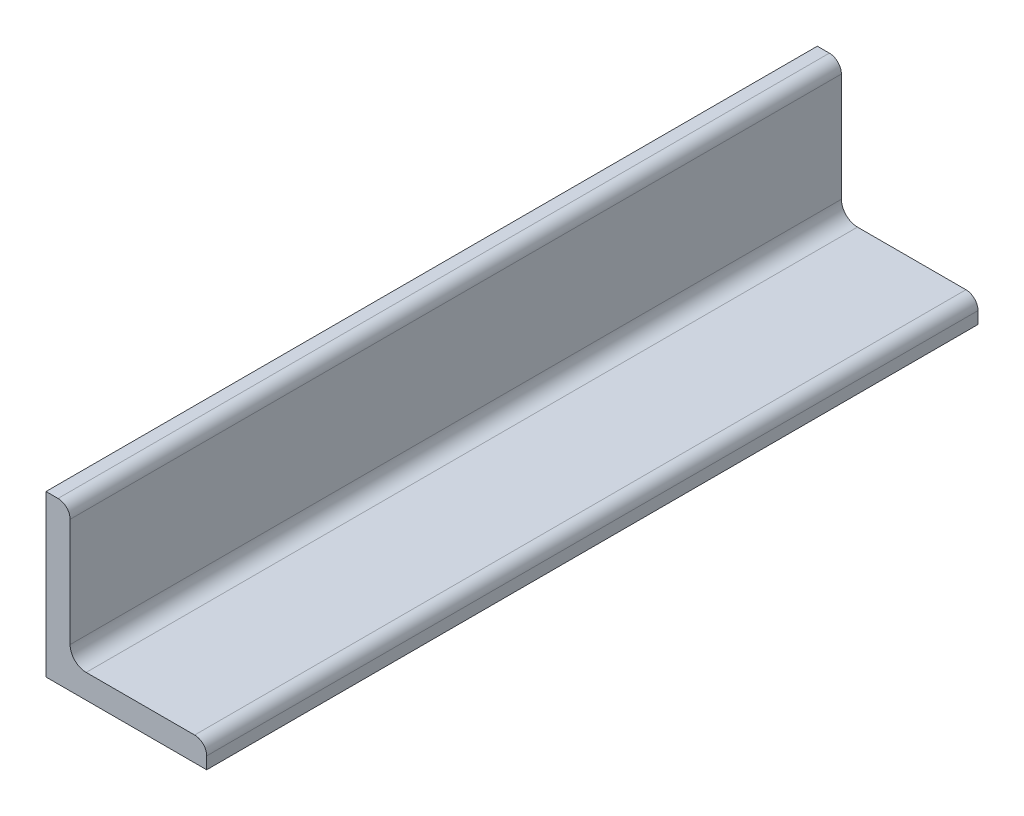
ISO-10303-21;
HEADER;
FILE_DESCRIPTION(('STEP AP214'),'2;1');
FILE_NAME('part.step','',(''),(''),'','','');
FILE_SCHEMA(('AUTOMOTIVE_DESIGN { 1 0 10303 214 1 1 1 1 }'));
ENDSEC;
DATA;
#1=APPLICATION_CONTEXT('core data for automotive mechanical design processes');
#2=APPLICATION_PROTOCOL_DEFINITION('international standard','automotive_design',2000,#1);
#3=PRODUCT_CONTEXT('',#1,'mechanical');
#4=PRODUCT('Part','Part','',(#3));
#5=PRODUCT_RELATED_PRODUCT_CATEGORY('part','',(#4));
#6=PRODUCT_DEFINITION_FORMATION('','',#4);
#7=PRODUCT_DEFINITION_CONTEXT('part definition',#1,'design');
#8=PRODUCT_DEFINITION('design','',#6,#7);
#9=PRODUCT_DEFINITION_SHAPE('','',#8);
#10=(LENGTH_UNIT() NAMED_UNIT(*) SI_UNIT(.MILLI.,.METRE.));
#11=(NAMED_UNIT(*) PLANE_ANGLE_UNIT() SI_UNIT($,.RADIAN.));
#12=(NAMED_UNIT(*) SI_UNIT($,.STERADIAN.) SOLID_ANGLE_UNIT());
#13=UNCERTAINTY_MEASURE_WITH_UNIT(LENGTH_MEASURE(1.E-05),#10,'distance_accuracy_value','');
#14=(GEOMETRIC_REPRESENTATION_CONTEXT(3) GLOBAL_UNCERTAINTY_ASSIGNED_CONTEXT((#13)) GLOBAL_UNIT_ASSIGNED_CONTEXT((#10,
#11,#12)) REPRESENTATION_CONTEXT('',''));
#15=CARTESIAN_POINT('',(0.,0.,0.));
#16=DIRECTION('',(0.,0.,1.));
#17=DIRECTION('',(1.,0.,0.));
#18=AXIS2_PLACEMENT_3D('',#15,#16,#17);
#19=CARTESIAN_POINT('',(0.897927251325018,63.8534276781816,304.8));
#20=DIRECTION('',(1.,0.,0.));
#21=DIRECTION('',(0.,0.,-1.));
#22=AXIS2_PLACEMENT_3D('',#19,#20,#21);
#23=PLANE('',#22);
#24=DIRECTION('',(0.,-1.,0.));
#25=VECTOR('',#24,1.);
#26=CARTESIAN_POINT('',(0.897927251325018,63.8534276781816,0.));
#27=LINE('',#26,#25);
#28=CARTESIAN_POINT('',(0.897927251325018,63.8534276781816,0.));
#29=VERTEX_POINT('',#28);
#30=CARTESIAN_POINT('',(0.897927251325018,0.353427678181561,0.));
#31=VERTEX_POINT('',#30);
#32=EDGE_CURVE('E135',#29,#31,#27,.T.);
#33=ORIENTED_EDGE('',*,*,#32,.T.);
#34=DIRECTION('',(0.,0.,-1.));
#35=VECTOR('',#34,1.);
#36=CARTESIAN_POINT('',(0.897927251325018,0.353427678181561,304.8));
#37=LINE('',#36,#35);
#38=CARTESIAN_POINT('',(0.897927251325018,0.353427678181561,304.8));
#39=VERTEX_POINT('',#38);
#40=EDGE_CURVE('E11',#39,#31,#37,.T.);
#41=ORIENTED_EDGE('',*,*,#40,.F.);
#42=DIRECTION('',(0.,-1.,0.));
#43=VECTOR('',#42,1.);
#44=CARTESIAN_POINT('',(0.897927251325018,63.8534276781816,304.8));
#45=LINE('',#44,#43);
#46=CARTESIAN_POINT('',(0.897927251325018,63.8534276781816,304.8));
#47=VERTEX_POINT('',#46);
#48=EDGE_CURVE('E151',#47,#39,#45,.T.);
#49=ORIENTED_EDGE('',*,*,#48,.F.);
#50=DIRECTION('',(0.,0.,-1.));
#51=VECTOR('',#50,1.);
#52=CARTESIAN_POINT('',(0.897927251325018,63.8534276781816,304.8));
#53=LINE('',#52,#51);
#54=EDGE_CURVE('E131',#47,#29,#53,.T.);
#55=ORIENTED_EDGE('',*,*,#54,.T.);
#56=EDGE_LOOP('',(#33,#41,#49,#55));
#57=FACE_BOUND('',#56,.T.);
#58=ADVANCED_FACE('F33',(#57),#23,.F.);
#59=CARTESIAN_POINT('',(0.897927251325018,0.353427678181561,304.8));
#60=DIRECTION('',(0.,1.,0.));
#61=DIRECTION('',(0.,0.,1.));
#62=AXIS2_PLACEMENT_3D('',#59,#60,#61);
#63=PLANE('',#62);
#64=DIRECTION('',(1.,0.,0.));
#65=VECTOR('',#64,1.);
#66=CARTESIAN_POINT('',(0.897927251325018,0.353427678181561,0.));
#67=LINE('',#66,#65);
#68=CARTESIAN_POINT('',(64.397927251325,0.353427678181561,0.));
#69=VERTEX_POINT('',#68);
#70=EDGE_CURVE('E138',#31,#69,#67,.T.);
#71=ORIENTED_EDGE('',*,*,#70,.T.);
#72=DIRECTION('',(0.,0.,-1.));
#73=VECTOR('',#72,1.);
#74=CARTESIAN_POINT('',(64.397927251325,0.353427678181561,304.8));
#75=LINE('',#74,#73);
#76=CARTESIAN_POINT('',(64.397927251325,0.353427678181561,304.8));
#77=VERTEX_POINT('',#76);
#78=EDGE_CURVE('E41',#77,#69,#75,.T.);
#79=ORIENTED_EDGE('',*,*,#78,.F.);
#80=DIRECTION('',(1.,0.,0.));
#81=VECTOR('',#80,1.);
#82=CARTESIAN_POINT('',(0.897927251325018,0.353427678181561,304.8));
#83=LINE('',#82,#81);
#84=EDGE_CURVE('E95',#39,#77,#83,.T.);
#85=ORIENTED_EDGE('',*,*,#84,.F.);
#86=ORIENTED_EDGE('',*,*,#40,.T.);
#87=EDGE_LOOP('',(#71,#79,#85,#86));
#88=FACE_BOUND('',#87,.T.);
#89=ADVANCED_FACE('F194',(#88),#63,.F.);
#90=CARTESIAN_POINT('',(64.397927251325,0.353427678181561,304.8));
#91=DIRECTION('',(-1.,0.,0.));
#92=DIRECTION('',(0.,0.,1.));
#93=AXIS2_PLACEMENT_3D('',#90,#91,#92);
#94=PLANE('',#93);
#95=DIRECTION('',(0.,1.,0.));
#96=VECTOR('',#95,1.);
#97=CARTESIAN_POINT('',(64.397927251325,0.353427678181561,0.));
#98=LINE('',#97,#96);
#99=CARTESIAN_POINT('',(64.397927251325,5.11592767818156,0.));
#100=VERTEX_POINT('',#99);
#101=EDGE_CURVE('E140',#69,#100,#98,.T.);
#102=ORIENTED_EDGE('',*,*,#101,.T.);
#103=DIRECTION('',(0.,0.,-1.));
#104=VECTOR('',#103,1.);
#105=CARTESIAN_POINT('',(64.397927251325,5.11592767818156,304.8));
#106=LINE('',#105,#104);
#107=CARTESIAN_POINT('',(64.397927251325,5.11592767818156,304.8));
#108=VERTEX_POINT('',#107);
#109=EDGE_CURVE('E161',#108,#100,#106,.T.);
#110=ORIENTED_EDGE('',*,*,#109,.F.);
#111=DIRECTION('',(0.,1.,0.));
#112=VECTOR('',#111,1.);
#113=CARTESIAN_POINT('',(64.397927251325,0.353427678181561,304.8));
#114=LINE('',#113,#112);
#115=EDGE_CURVE('E169',#77,#108,#114,.T.);
#116=ORIENTED_EDGE('',*,*,#115,.F.);
#117=ORIENTED_EDGE('',*,*,#78,.T.);
#118=EDGE_LOOP('',(#102,#110,#116,#117));
#119=FACE_BOUND('',#118,.T.);
#120=ADVANCED_FACE('F167',(#119),#94,.F.);
#121=CARTESIAN_POINT('',(59.635427251325,5.11592767818156,304.8));
#122=DIRECTION('',(0.,0.,-1.));
#123=DIRECTION('',(-1.,0.,0.));
#124=AXIS2_PLACEMENT_3D('',#121,#122,#123);
#125=CYLINDRICAL_SURFACE('',#124,4.7625);
#126=CARTESIAN_POINT('',(59.635427251325,5.11592767818156,0.));
#127=DIRECTION('',(0.,0.,1.));
#128=DIRECTION('',(1.,0.,0.));
#129=AXIS2_PLACEMENT_3D('',#126,#127,#128);
#130=CIRCLE('',#129,4.7625);
#131=CARTESIAN_POINT('',(59.635427251325,9.87842767818156,0.));
#132=VERTEX_POINT('',#131);
#133=EDGE_CURVE('E142',#100,#132,#130,.T.);
#134=ORIENTED_EDGE('',*,*,#133,.T.);
#135=DIRECTION('',(0.,0.,-1.));
#136=VECTOR('',#135,1.);
#137=CARTESIAN_POINT('',(59.635427251325,9.87842767818156,304.8));
#138=LINE('',#137,#136);
#139=CARTESIAN_POINT('',(59.635427251325,9.87842767818156,304.8));
#140=VERTEX_POINT('',#139);
#141=EDGE_CURVE('E158',#140,#132,#138,.T.);
#142=ORIENTED_EDGE('',*,*,#141,.F.);
#143=CARTESIAN_POINT('',(59.635427251325,5.11592767818156,304.8));
#144=DIRECTION('',(0.,0.,1.));
#145=DIRECTION('',(1.,0.,0.));
#146=AXIS2_PLACEMENT_3D('',#143,#144,#145);
#147=CIRCLE('',#146,4.7625);
#148=EDGE_CURVE('E185',#108,#140,#147,.T.);
#149=ORIENTED_EDGE('',*,*,#148,.F.);
#150=ORIENTED_EDGE('',*,*,#109,.T.);
#151=EDGE_LOOP('',(#134,#142,#149,#150));
#152=FACE_BOUND('',#151,.T.);
#153=ADVANCED_FACE('F178',(#152),#125,.T.);
#154=CARTESIAN_POINT('',(59.635427251325,9.87842767818156,304.8));
#155=DIRECTION('',(0.,-1.,0.));
#156=DIRECTION('',(0.,0.,-1.));
#157=AXIS2_PLACEMENT_3D('',#154,#155,#156);
#158=PLANE('',#157);
#159=DIRECTION('',(-1.,0.,0.));
#160=VECTOR('',#159,1.);
#161=CARTESIAN_POINT('',(59.635427251325,9.87842767818156,0.));
#162=LINE('',#161,#160);
#163=CARTESIAN_POINT('',(16.772927251325,9.87842767818156,0.));
#164=VERTEX_POINT('',#163);
#165=EDGE_CURVE('E144',#132,#164,#162,.T.);
#166=ORIENTED_EDGE('',*,*,#165,.T.);
#167=DIRECTION('',(0.,0.,-1.));
#168=VECTOR('',#167,1.);
#169=CARTESIAN_POINT('',(16.772927251325,9.87842767818156,304.8));
#170=LINE('',#169,#168);
#171=CARTESIAN_POINT('',(16.772927251325,9.87842767818156,304.8));
#172=VERTEX_POINT('',#171);
#173=EDGE_CURVE('E155',#172,#164,#170,.T.);
#174=ORIENTED_EDGE('',*,*,#173,.F.);
#175=DIRECTION('',(-1.,0.,0.));
#176=VECTOR('',#175,1.);
#177=CARTESIAN_POINT('',(59.635427251325,9.87842767818156,304.8));
#178=LINE('',#177,#176);
#179=EDGE_CURVE('E184',#140,#172,#178,.T.);
#180=ORIENTED_EDGE('',*,*,#179,.F.);
#181=ORIENTED_EDGE('',*,*,#141,.T.);
#182=EDGE_LOOP('',(#166,#174,#180,#181));
#183=FACE_BOUND('',#182,.T.);
#184=ADVANCED_FACE('F182',(#183),#158,.F.);
#185=CARTESIAN_POINT('',(16.772927251325,16.2284276781816,304.8));
#186=DIRECTION('',(0.,0.,-1.));
#187=DIRECTION('',(-1.,0.,0.));
#188=AXIS2_PLACEMENT_3D('',#185,#186,#187);
#189=CYLINDRICAL_SURFACE('',#188,6.34999999999999);
#190=CARTESIAN_POINT('',(16.772927251325,16.2284276781816,0.));
#191=DIRECTION('',(0.,0.,-1.));
#192=DIRECTION('',(1.,0.,0.));
#193=AXIS2_PLACEMENT_3D('',#190,#191,#192);
#194=CIRCLE('',#193,6.34999999999999);
#195=CARTESIAN_POINT('',(10.422927251325,16.2284276781816,0.));
#196=VERTEX_POINT('',#195);
#197=EDGE_CURVE('E146',#164,#196,#194,.T.);
#198=ORIENTED_EDGE('',*,*,#197,.T.);
#199=DIRECTION('',(0.,0.,-1.));
#200=VECTOR('',#199,1.);
#201=CARTESIAN_POINT('',(10.422927251325,16.2284276781816,304.8));
#202=LINE('',#201,#200);
#203=CARTESIAN_POINT('',(10.422927251325,16.2284276781816,304.8));
#204=VERTEX_POINT('',#203);
#205=EDGE_CURVE('E126',#204,#196,#202,.T.);
#206=ORIENTED_EDGE('',*,*,#205,.F.);
#207=CARTESIAN_POINT('',(16.772927251325,16.2284276781816,304.8));
#208=DIRECTION('',(0.,0.,-1.));
#209=DIRECTION('',(1.,0.,0.));
#210=AXIS2_PLACEMENT_3D('',#207,#208,#209);
#211=CIRCLE('',#210,6.34999999999999);
#212=EDGE_CURVE('E117',#172,#204,#211,.T.);
#213=ORIENTED_EDGE('',*,*,#212,.F.);
#214=ORIENTED_EDGE('',*,*,#173,.T.);
#215=EDGE_LOOP('',(#198,#206,#213,#214));
#216=FACE_BOUND('',#215,.T.);
#217=ADVANCED_FACE('F206',(#216),#189,.F.);
#218=CARTESIAN_POINT('',(10.422927251325,16.2284276781816,304.8));
#219=DIRECTION('',(-1.,0.,0.));
#220=DIRECTION('',(0.,0.,1.));
#221=AXIS2_PLACEMENT_3D('',#218,#219,#220);
#222=PLANE('',#221);
#223=DIRECTION('',(0.,1.,0.));
#224=VECTOR('',#223,1.);
#225=CARTESIAN_POINT('',(10.422927251325,16.2284276781816,0.));
#226=LINE('',#225,#224);
#227=CARTESIAN_POINT('',(10.422927251325,59.0909276781816,0.));
#228=VERTEX_POINT('',#227);
#229=EDGE_CURVE('E125',#196,#228,#226,.T.);
#230=ORIENTED_EDGE('',*,*,#229,.T.);
#231=DIRECTION('',(0.,0.,-1.));
#232=VECTOR('',#231,1.);
#233=CARTESIAN_POINT('',(10.422927251325,59.0909276781816,304.8));
#234=LINE('',#233,#232);
#235=CARTESIAN_POINT('',(10.422927251325,59.0909276781816,304.8));
#236=VERTEX_POINT('',#235);
#237=EDGE_CURVE('E122',#236,#228,#234,.T.);
#238=ORIENTED_EDGE('',*,*,#237,.F.);
#239=DIRECTION('',(0.,1.,0.));
#240=VECTOR('',#239,1.);
#241=CARTESIAN_POINT('',(10.422927251325,16.2284276781816,304.8));
#242=LINE('',#241,#240);
#243=EDGE_CURVE('E111',#204,#236,#242,.T.);
#244=ORIENTED_EDGE('',*,*,#243,.F.);
#245=ORIENTED_EDGE('',*,*,#205,.T.);
#246=EDGE_LOOP('',(#230,#238,#244,#245));
#247=FACE_BOUND('',#246,.T.);
#248=ADVANCED_FACE('F123',(#247),#222,.F.);
#249=CARTESIAN_POINT('',(5.66042725132501,59.0909276781816,304.8));
#250=DIRECTION('',(0.,0.,-1.));
#251=DIRECTION('',(-1.,0.,0.));
#252=AXIS2_PLACEMENT_3D('',#249,#250,#251);
#253=CYLINDRICAL_SURFACE('',#252,4.7625);
#254=CARTESIAN_POINT('',(5.66042725132501,59.0909276781816,0.));
#255=DIRECTION('',(0.,0.,1.));
#256=DIRECTION('',(1.,0.,0.));
#257=AXIS2_PLACEMENT_3D('',#254,#255,#256);
#258=CIRCLE('',#257,4.7625);
#259=CARTESIAN_POINT('',(5.66042725132502,63.8534276781816,0.));
#260=VERTEX_POINT('',#259);
#261=EDGE_CURVE('E81',#228,#260,#258,.T.);
#262=ORIENTED_EDGE('',*,*,#261,.T.);
#263=DIRECTION('',(0.,0.,-1.));
#264=VECTOR('',#263,1.);
#265=CARTESIAN_POINT('',(5.66042725132502,63.8534276781816,304.8));
#266=LINE('',#265,#264);
#267=CARTESIAN_POINT('',(5.66042725132502,63.8534276781816,304.8));
#268=VERTEX_POINT('',#267);
#269=EDGE_CURVE('E127',#268,#260,#266,.T.);
#270=ORIENTED_EDGE('',*,*,#269,.F.);
#271=CARTESIAN_POINT('',(5.66042725132501,59.0909276781816,304.8));
#272=DIRECTION('',(0.,0.,1.));
#273=DIRECTION('',(1.,0.,0.));
#274=AXIS2_PLACEMENT_3D('',#271,#272,#273);
#275=CIRCLE('',#274,4.7625);
#276=EDGE_CURVE('E115',#236,#268,#275,.T.);
#277=ORIENTED_EDGE('',*,*,#276,.F.);
#278=ORIENTED_EDGE('',*,*,#237,.T.);
#279=EDGE_LOOP('',(#262,#270,#277,#278));
#280=FACE_BOUND('',#279,.T.);
#281=ADVANCED_FACE('F129',(#280),#253,.T.);
#282=CARTESIAN_POINT('',(5.66042725132502,63.8534276781816,304.8));
#283=DIRECTION('',(0.,-1.,0.));
#284=DIRECTION('',(0.,0.,-1.));
#285=AXIS2_PLACEMENT_3D('',#282,#283,#284);
#286=PLANE('',#285);
#287=DIRECTION('',(-1.,0.,0.));
#288=VECTOR('',#287,1.);
#289=CARTESIAN_POINT('',(5.66042725132502,63.8534276781816,0.));
#290=LINE('',#289,#288);
#291=EDGE_CURVE('E87',#260,#29,#290,.T.);
#292=ORIENTED_EDGE('',*,*,#291,.T.);
#293=ORIENTED_EDGE('',*,*,#54,.F.);
#294=DIRECTION('',(-1.,0.,0.));
#295=VECTOR('',#294,1.);
#296=CARTESIAN_POINT('',(5.66042725132502,63.8534276781816,304.8));
#297=LINE('',#296,#295);
#298=EDGE_CURVE('E49',#268,#47,#297,.T.);
#299=ORIENTED_EDGE('',*,*,#298,.F.);
#300=ORIENTED_EDGE('',*,*,#269,.T.);
#301=EDGE_LOOP('',(#292,#293,#299,#300));
#302=FACE_BOUND('',#301,.T.);
#303=ADVANCED_FACE('F214',(#302),#286,.F.);
#304=CARTESIAN_POINT('',(59.635427251325,5.11592767818156,304.8));
#305=DIRECTION('',(0.,0.,1.));
#306=DIRECTION('',(1.,0.,0.));
#307=AXIS2_PLACEMENT_3D('',#304,#305,#306);
#308=PLANE('',#307);
#309=ORIENTED_EDGE('',*,*,#48,.T.);
#310=ORIENTED_EDGE('',*,*,#84,.T.);
#311=ORIENTED_EDGE('',*,*,#115,.T.);
#312=ORIENTED_EDGE('',*,*,#148,.T.);
#313=ORIENTED_EDGE('',*,*,#179,.T.);
#314=ORIENTED_EDGE('',*,*,#212,.T.);
#315=ORIENTED_EDGE('',*,*,#243,.T.);
#316=ORIENTED_EDGE('',*,*,#276,.T.);
#317=ORIENTED_EDGE('',*,*,#298,.T.);
#318=EDGE_LOOP('',(#309,#310,#311,#312,#313,#314,#315,#316,#317));
#319=FACE_BOUND('',#318,.T.);
#320=ADVANCED_FACE('F113',(#319),#308,.T.);
#321=CARTESIAN_POINT('',(59.635427251325,5.11592767818156,0.));
#322=DIRECTION('',(0.,0.,1.));
#323=DIRECTION('',(1.,0.,0.));
#324=AXIS2_PLACEMENT_3D('',#321,#322,#323);
#325=PLANE('',#324);
#326=ORIENTED_EDGE('',*,*,#32,.F.);
#327=ORIENTED_EDGE('',*,*,#291,.F.);
#328=ORIENTED_EDGE('',*,*,#261,.F.);
#329=ORIENTED_EDGE('',*,*,#229,.F.);
#330=ORIENTED_EDGE('',*,*,#197,.F.);
#331=ORIENTED_EDGE('',*,*,#165,.F.);
#332=ORIENTED_EDGE('',*,*,#133,.F.);
#333=ORIENTED_EDGE('',*,*,#101,.F.);
#334=ORIENTED_EDGE('',*,*,#70,.F.);
#335=EDGE_LOOP('',(#326,#327,#328,#329,#330,#331,#332,#333,#334));
#336=FACE_BOUND('',#335,.T.);
#337=ADVANCED_FACE('F173',(#336),#325,.F.);
#338=CLOSED_SHELL('',(#58,#89,#120,#153,#184,#217,#248,#281,#303,#320,#337));
#339=MANIFOLD_SOLID_BREP('B2',#338);
#340=ADVANCED_BREP_SHAPE_REPRESENTATION('',(#18,#339),#14);
#341=SHAPE_DEFINITION_REPRESENTATION(#9,#340);
ENDSEC;
END-ISO-10303-21;
